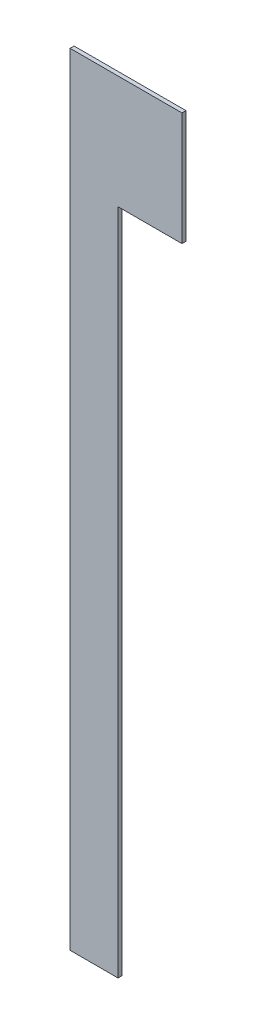
ISO-10303-21;
HEADER;
FILE_DESCRIPTION(('STEP AP214'),'2;1');
FILE_NAME('part.step','',(''),(''),'','','');
FILE_SCHEMA(('AUTOMOTIVE_DESIGN { 1 0 10303 214 1 1 1 1 }'));
ENDSEC;
DATA;
#1=APPLICATION_CONTEXT('core data for automotive mechanical design processes');
#2=APPLICATION_PROTOCOL_DEFINITION('international standard','automotive_design',2000,#1);
#3=PRODUCT_CONTEXT('',#1,'mechanical');
#4=PRODUCT('Part','Part','',(#3));
#5=PRODUCT_RELATED_PRODUCT_CATEGORY('part','',(#4));
#6=PRODUCT_DEFINITION_FORMATION('','',#4);
#7=PRODUCT_DEFINITION_CONTEXT('part definition',#1,'design');
#8=PRODUCT_DEFINITION('design','',#6,#7);
#9=PRODUCT_DEFINITION_SHAPE('','',#8);
#10=(LENGTH_UNIT() NAMED_UNIT(*) SI_UNIT(.MILLI.,.METRE.));
#11=(NAMED_UNIT(*) PLANE_ANGLE_UNIT() SI_UNIT($,.RADIAN.));
#12=(NAMED_UNIT(*) SI_UNIT($,.STERADIAN.) SOLID_ANGLE_UNIT());
#13=UNCERTAINTY_MEASURE_WITH_UNIT(LENGTH_MEASURE(1.E-05),#10,'distance_accuracy_value','');
#14=(GEOMETRIC_REPRESENTATION_CONTEXT(3) GLOBAL_UNCERTAINTY_ASSIGNED_CONTEXT((#13)) GLOBAL_UNIT_ASSIGNED_CONTEXT((#10,
#11,#12)) REPRESENTATION_CONTEXT('',''));
#15=CARTESIAN_POINT('',(0.,0.,0.));
#16=DIRECTION('',(0.,0.,1.));
#17=DIRECTION('',(1.,0.,0.));
#18=AXIS2_PLACEMENT_3D('',#15,#16,#17);
#19=CARTESIAN_POINT('',(350.000000000002,-0.749999999999584,-12.5));
#20=DIRECTION('',(1.,0.,0.));
#21=DIRECTION('',(0.,0.,-1.));
#22=AXIS2_PLACEMENT_3D('',#19,#20,#21);
#23=PLANE('',#22);
#24=DIRECTION('',(0.,1.,0.));
#25=VECTOR('',#24,1.);
#26=CARTESIAN_POINT('',(350.000000000002,-0.749999999999584,0.));
#27=LINE('',#26,#25);
#28=CARTESIAN_POINT('',(350.000000000002,-355.,0.));
#29=VERTEX_POINT('',#28);
#30=CARTESIAN_POINT('',(350.000000000002,-0.749999999999584,0.));
#31=VERTEX_POINT('',#30);
#32=EDGE_CURVE('E120',#29,#31,#27,.T.);
#33=ORIENTED_EDGE('',*,*,#32,.F.);
#34=DIRECTION('',(0.,0.,1.));
#35=VECTOR('',#34,1.);
#36=CARTESIAN_POINT('',(350.000000000002,-355.,-12.5));
#37=LINE('',#36,#35);
#38=CARTESIAN_POINT('',(350.000000000002,-355.,-12.5));
#39=VERTEX_POINT('',#38);
#40=EDGE_CURVE('E11',#39,#29,#37,.T.);
#41=ORIENTED_EDGE('',*,*,#40,.F.);
#42=DIRECTION('',(0.,1.,0.));
#43=VECTOR('',#42,1.);
#44=CARTESIAN_POINT('',(350.000000000002,-0.749999999999584,-12.5));
#45=LINE('',#44,#43);
#46=CARTESIAN_POINT('',(350.000000000002,-0.749999999999584,-12.5));
#47=VERTEX_POINT('',#46);
#48=EDGE_CURVE('E134',#39,#47,#45,.T.);
#49=ORIENTED_EDGE('',*,*,#48,.T.);
#50=DIRECTION('',(0.,0.,1.));
#51=VECTOR('',#50,1.);
#52=CARTESIAN_POINT('',(350.000000000002,-0.749999999999584,-12.5));
#53=LINE('',#52,#51);
#54=EDGE_CURVE('E38',#47,#31,#53,.T.);
#55=ORIENTED_EDGE('',*,*,#54,.T.);
#56=EDGE_LOOP('',(#33,#41,#49,#55));
#57=FACE_BOUND('',#56,.T.);
#58=ADVANCED_FACE('F35',(#57),#23,.T.);
#59=CARTESIAN_POINT('',(150.,-355.,-12.5));
#60=DIRECTION('',(0.,-1.,0.));
#61=DIRECTION('',(0.,0.,-1.));
#62=AXIS2_PLACEMENT_3D('',#59,#60,#61);
#63=PLANE('',#62);
#64=DIRECTION('',(1.,0.,0.));
#65=VECTOR('',#64,1.);
#66=CARTESIAN_POINT('',(150.,-355.,0.));
#67=LINE('',#66,#65);
#68=CARTESIAN_POINT('',(150.,-355.,0.));
#69=VERTEX_POINT('',#68);
#70=EDGE_CURVE('E132',#69,#29,#67,.T.);
#71=ORIENTED_EDGE('',*,*,#70,.F.);
#72=DIRECTION('',(0.,0.,1.));
#73=VECTOR('',#72,1.);
#74=CARTESIAN_POINT('',(150.,-355.,-12.5));
#75=LINE('',#74,#73);
#76=CARTESIAN_POINT('',(150.,-355.,-12.5));
#77=VERTEX_POINT('',#76);
#78=EDGE_CURVE('E44',#77,#69,#75,.T.);
#79=ORIENTED_EDGE('',*,*,#78,.F.);
#80=DIRECTION('',(1.,0.,0.));
#81=VECTOR('',#80,1.);
#82=CARTESIAN_POINT('',(150.,-355.,-12.5));
#83=LINE('',#82,#81);
#84=EDGE_CURVE('E110',#77,#39,#83,.T.);
#85=ORIENTED_EDGE('',*,*,#84,.T.);
#86=ORIENTED_EDGE('',*,*,#40,.T.);
#87=EDGE_LOOP('',(#71,#79,#85,#86));
#88=FACE_BOUND('',#87,.T.);
#89=ADVANCED_FACE('F142',(#88),#63,.T.);
#90=CARTESIAN_POINT('',(150.,-2445.,-12.5));
#91=DIRECTION('',(1.,0.,0.));
#92=DIRECTION('',(0.,0.,-1.));
#93=AXIS2_PLACEMENT_3D('',#90,#91,#92);
#94=PLANE('',#93);
#95=DIRECTION('',(0.,1.,0.));
#96=VECTOR('',#95,1.);
#97=CARTESIAN_POINT('',(150.,-2445.,0.));
#98=LINE('',#97,#96);
#99=CARTESIAN_POINT('',(150.,-2445.,0.));
#100=VERTEX_POINT('',#99);
#101=EDGE_CURVE('E97',#100,#69,#98,.T.);
#102=ORIENTED_EDGE('',*,*,#101,.F.);
#103=DIRECTION('',(0.,0.,1.));
#104=VECTOR('',#103,1.);
#105=CARTESIAN_POINT('',(150.,-2445.,-12.5));
#106=LINE('',#105,#104);
#107=CARTESIAN_POINT('',(150.,-2445.,-12.5));
#108=VERTEX_POINT('',#107);
#109=EDGE_CURVE('E92',#108,#100,#106,.T.);
#110=ORIENTED_EDGE('',*,*,#109,.F.);
#111=DIRECTION('',(0.,1.,0.));
#112=VECTOR('',#111,1.);
#113=CARTESIAN_POINT('',(150.,-2445.,-12.5));
#114=LINE('',#113,#112);
#115=EDGE_CURVE('E95',#108,#77,#114,.T.);
#116=ORIENTED_EDGE('',*,*,#115,.T.);
#117=ORIENTED_EDGE('',*,*,#78,.T.);
#118=EDGE_LOOP('',(#102,#110,#116,#117));
#119=FACE_BOUND('',#118,.T.);
#120=ADVANCED_FACE('F94',(#119),#94,.T.);
#121=CARTESIAN_POINT('',(150.,-2445.,-12.5));
#122=DIRECTION('',(0.,-1.,0.));
#123=DIRECTION('',(0.,0.,-1.));
#124=AXIS2_PLACEMENT_3D('',#121,#122,#123);
#125=PLANE('',#124);
#126=DIRECTION('',(1.,0.,0.));
#127=VECTOR('',#126,1.);
#128=CARTESIAN_POINT('',(150.,-2445.,0.));
#129=LINE('',#128,#127);
#130=CARTESIAN_POINT('',(0.,-2445.,0.));
#131=VERTEX_POINT('',#130);
#132=EDGE_CURVE('E129',#131,#100,#129,.T.);
#133=ORIENTED_EDGE('',*,*,#132,.F.);
#134=DIRECTION('',(0.,0.,1.));
#135=VECTOR('',#134,1.);
#136=CARTESIAN_POINT('',(0.,-2445.,-12.5));
#137=LINE('',#136,#135);
#138=CARTESIAN_POINT('',(0.,-2445.,-12.5));
#139=VERTEX_POINT('',#138);
#140=EDGE_CURVE('E102',#139,#131,#137,.T.);
#141=ORIENTED_EDGE('',*,*,#140,.F.);
#142=DIRECTION('',(1.,0.,0.));
#143=VECTOR('',#142,1.);
#144=CARTESIAN_POINT('',(150.,-2445.,-12.5));
#145=LINE('',#144,#143);
#146=EDGE_CURVE('E108',#139,#108,#145,.T.);
#147=ORIENTED_EDGE('',*,*,#146,.T.);
#148=ORIENTED_EDGE('',*,*,#109,.T.);
#149=EDGE_LOOP('',(#133,#141,#147,#148));
#150=FACE_BOUND('',#149,.T.);
#151=ADVANCED_FACE('F112',(#150),#125,.T.);
#152=CARTESIAN_POINT('',(0.,-0.749999999999626,-12.5));
#153=DIRECTION('',(-1.,0.,0.));
#154=DIRECTION('',(0.,0.,1.));
#155=AXIS2_PLACEMENT_3D('',#152,#153,#154);
#156=PLANE('',#155);
#157=DIRECTION('',(0.,-1.,0.));
#158=VECTOR('',#157,1.);
#159=CARTESIAN_POINT('',(0.,-0.749999999999626,0.));
#160=LINE('',#159,#158);
#161=CARTESIAN_POINT('',(0.,-0.749999999999626,0.));
#162=VERTEX_POINT('',#161);
#163=EDGE_CURVE('E126',#162,#131,#160,.T.);
#164=ORIENTED_EDGE('',*,*,#163,.F.);
#165=DIRECTION('',(0.,0.,1.));
#166=VECTOR('',#165,1.);
#167=CARTESIAN_POINT('',(0.,-0.749999999999626,-12.5));
#168=LINE('',#167,#166);
#169=CARTESIAN_POINT('',(0.,-0.749999999999626,-12.5));
#170=VERTEX_POINT('',#169);
#171=EDGE_CURVE('E137',#170,#162,#168,.T.);
#172=ORIENTED_EDGE('',*,*,#171,.F.);
#173=DIRECTION('',(0.,-1.,0.));
#174=VECTOR('',#173,1.);
#175=CARTESIAN_POINT('',(0.,-0.749999999999626,-12.5));
#176=LINE('',#175,#174);
#177=EDGE_CURVE('E113',#170,#139,#176,.T.);
#178=ORIENTED_EDGE('',*,*,#177,.T.);
#179=ORIENTED_EDGE('',*,*,#140,.T.);
#180=EDGE_LOOP('',(#164,#172,#178,#179));
#181=FACE_BOUND('',#180,.T.);
#182=ADVANCED_FACE('F155',(#181),#156,.T.);
#183=CARTESIAN_POINT('',(350.000000000002,-0.749999999999584,-12.5));
#184=DIRECTION('',(0.,1.,0.));
#185=DIRECTION('',(-1.,0.,0.));
#186=AXIS2_PLACEMENT_3D('',#183,#184,#185);
#187=PLANE('',#186);
#188=DIRECTION('',(-1.,0.,0.));
#189=VECTOR('',#188,1.);
#190=CARTESIAN_POINT('',(350.000000000002,-0.749999999999584,0.));
#191=LINE('',#190,#189);
#192=EDGE_CURVE('E123',#31,#162,#191,.T.);
#193=ORIENTED_EDGE('',*,*,#192,.F.);
#194=ORIENTED_EDGE('',*,*,#54,.F.);
#195=DIRECTION('',(-1.,0.,0.));
#196=VECTOR('',#195,1.);
#197=CARTESIAN_POINT('',(350.000000000002,-0.749999999999584,-12.5));
#198=LINE('',#197,#196);
#199=EDGE_CURVE('E115',#47,#170,#198,.T.);
#200=ORIENTED_EDGE('',*,*,#199,.T.);
#201=ORIENTED_EDGE('',*,*,#171,.T.);
#202=EDGE_LOOP('',(#193,#194,#200,#201));
#203=FACE_BOUND('',#202,.T.);
#204=ADVANCED_FACE('F139',(#203),#187,.T.);
#205=CARTESIAN_POINT('',(0.,0.,-12.5));
#206=DIRECTION('',(0.,0.,1.));
#207=DIRECTION('',(1.,0.,0.));
#208=AXIS2_PLACEMENT_3D('',#205,#206,#207);
#209=PLANE('',#208);
#210=ORIENTED_EDGE('',*,*,#48,.F.);
#211=ORIENTED_EDGE('',*,*,#84,.F.);
#212=ORIENTED_EDGE('',*,*,#115,.F.);
#213=ORIENTED_EDGE('',*,*,#146,.F.);
#214=ORIENTED_EDGE('',*,*,#177,.F.);
#215=ORIENTED_EDGE('',*,*,#199,.F.);
#216=EDGE_LOOP('',(#210,#211,#212,#213,#214,#215));
#217=FACE_BOUND('',#216,.T.);
#218=ADVANCED_FACE('F106',(#217),#209,.F.);
#219=CARTESIAN_POINT('',(0.,0.,0.));
#220=DIRECTION('',(0.,0.,1.));
#221=DIRECTION('',(1.,0.,0.));
#222=AXIS2_PLACEMENT_3D('',#219,#220,#221);
#223=PLANE('',#222);
#224=ORIENTED_EDGE('',*,*,#32,.T.);
#225=ORIENTED_EDGE('',*,*,#192,.T.);
#226=ORIENTED_EDGE('',*,*,#163,.T.);
#227=ORIENTED_EDGE('',*,*,#132,.T.);
#228=ORIENTED_EDGE('',*,*,#101,.T.);
#229=ORIENTED_EDGE('',*,*,#70,.T.);
#230=EDGE_LOOP('',(#224,#225,#226,#227,#228,#229));
#231=FACE_BOUND('',#230,.T.);
#232=ADVANCED_FACE('F141',(#231),#223,.T.);
#233=CLOSED_SHELL('',(#58,#89,#120,#151,#182,#204,#218,#232));
#234=MANIFOLD_SOLID_BREP('B2',#233);
#235=ADVANCED_BREP_SHAPE_REPRESENTATION('',(#18,#234),#14);
#236=SHAPE_DEFINITION_REPRESENTATION(#9,#235);
ENDSEC;
END-ISO-10303-21;
